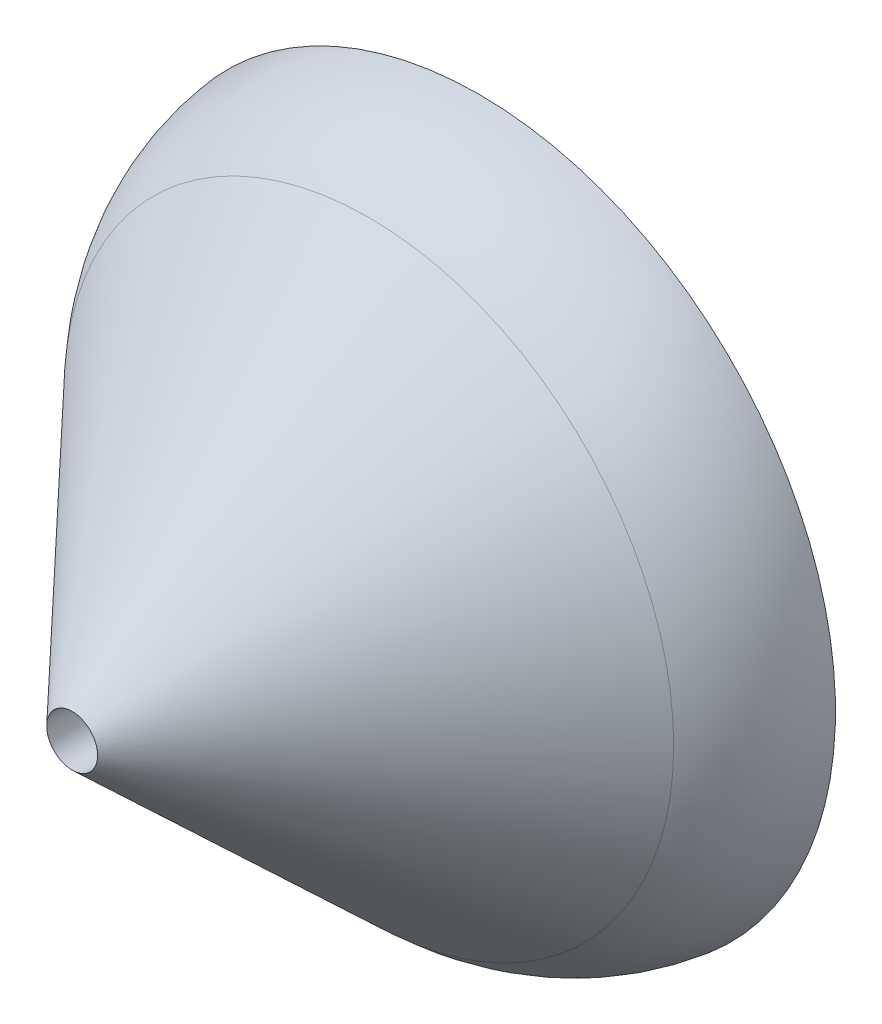
ISO-10303-21;
HEADER;
FILE_DESCRIPTION(('STEP AP214'),'2;1');
FILE_NAME('part.step','',(''),(''),'','','');
FILE_SCHEMA(('AUTOMOTIVE_DESIGN { 1 0 10303 214 1 1 1 1 }'));
ENDSEC;
DATA;
#1=APPLICATION_CONTEXT('core data for automotive mechanical design processes');
#2=APPLICATION_PROTOCOL_DEFINITION('international standard','automotive_design',2000,#1);
#3=PRODUCT_CONTEXT('',#1,'mechanical');
#4=PRODUCT('Part','Part','',(#3));
#5=PRODUCT_RELATED_PRODUCT_CATEGORY('part','',(#4));
#6=PRODUCT_DEFINITION_FORMATION('','',#4);
#7=PRODUCT_DEFINITION_CONTEXT('part definition',#1,'design');
#8=PRODUCT_DEFINITION('design','',#6,#7);
#9=PRODUCT_DEFINITION_SHAPE('','',#8);
#10=(LENGTH_UNIT() NAMED_UNIT(*) SI_UNIT(.MILLI.,.METRE.));
#11=(NAMED_UNIT(*) PLANE_ANGLE_UNIT() SI_UNIT($,.RADIAN.));
#12=(NAMED_UNIT(*) SI_UNIT($,.STERADIAN.) SOLID_ANGLE_UNIT());
#13=UNCERTAINTY_MEASURE_WITH_UNIT(LENGTH_MEASURE(1.E-05),#10,'distance_accuracy_value','');
#14=(GEOMETRIC_REPRESENTATION_CONTEXT(3) GLOBAL_UNCERTAINTY_ASSIGNED_CONTEXT((#13)) GLOBAL_UNIT_ASSIGNED_CONTEXT((#10,
#11,#12)) REPRESENTATION_CONTEXT('',''));
#15=CARTESIAN_POINT('',(0.,0.,0.));
#16=DIRECTION('',(0.,0.,1.));
#17=DIRECTION('',(1.,0.,0.));
#18=AXIS2_PLACEMENT_3D('',#15,#16,#17);
#19=CARTESIAN_POINT('',(0.,-88.9,0.));
#20=DIRECTION('',(0.,0.,1.));
#21=DIRECTION('',(0.,-1.,0.));
#22=AXIS2_PLACEMENT_3D('',#19,#20,#21);
#23=PLANE('',#22);
#24=CARTESIAN_POINT('',(0.,0.,0.));
#25=DIRECTION('',(0.,0.,-1.));
#26=DIRECTION('',(0.,1.,0.));
#27=AXIS2_PLACEMENT_3D('',#24,#25,#26);
#28=CIRCLE('',#27,50.8);
#29=CARTESIAN_POINT('',(0.,50.8,0.));
#30=VERTEX_POINT('',#29);
#31=EDGE_CURVE('E46',#30,#30,#28,.T.);
#32=ORIENTED_EDGE('',*,*,#31,.F.);
#33=EDGE_LOOP('',(#32));
#34=FACE_BOUND('',#33,.T.);
#35=CARTESIAN_POINT('',(0.,0.,0.));
#36=DIRECTION('',(0.,0.,-1.));
#37=DIRECTION('',(0.,1.,0.));
#38=AXIS2_PLACEMENT_3D('',#35,#36,#37);
#39=CIRCLE('',#38,88.9);
#40=CARTESIAN_POINT('',(0.,88.9,0.));
#41=VERTEX_POINT('',#40);
#42=EDGE_CURVE('E74',#41,#41,#39,.T.);
#43=ORIENTED_EDGE('',*,*,#42,.T.);
#44=EDGE_LOOP('',(#43));
#45=FACE_BOUND('',#44,.T.);
#46=ADVANCED_FACE('F39',(#34,#45),#23,.F.);
#47=CARTESIAN_POINT('',(0.,0.,0.));
#48=DIRECTION('',(0.,0.,-1.));
#49=DIRECTION('',(0.,1.,0.));
#50=AXIS2_PLACEMENT_3D('',#47,#48,#49);
#51=CYLINDRICAL_SURFACE('',#50,50.8000000000001);
#52=CARTESIAN_POINT('',(0.,0.,13.9604880961796));
#53=DIRECTION('',(0.,0.,-1.));
#54=DIRECTION('',(0.,1.,0.));
#55=AXIS2_PLACEMENT_3D('',#52,#53,#54);
#56=CIRCLE('',#55,50.8000000000001);
#57=CARTESIAN_POINT('',(0.,50.8000000000001,13.9604880961797));
#58=VERTEX_POINT('',#57);
#59=EDGE_CURVE('E50',#58,#58,#56,.T.);
#60=ORIENTED_EDGE('',*,*,#59,.F.);
#61=EDGE_LOOP('',(#60));
#62=FACE_BOUND('',#61,.T.);
#63=ORIENTED_EDGE('',*,*,#31,.T.);
#64=EDGE_LOOP('',(#63));
#65=FACE_BOUND('',#64,.T.);
#66=ADVANCED_FACE('F88',(#62,#65),#51,.F.);
#67=CARTESIAN_POINT('',(0.,0.,13.9604880961796));
#68=DIRECTION('',(0.,0.,-1.));
#69=DIRECTION('',(0.,1.,0.));
#70=AXIS2_PLACEMENT_3D('',#67,#68,#69);
#71=CONICAL_SURFACE('',#70,50.8000000000001,0.755502105379967);
#72=CARTESIAN_POINT('',(0.,0.,22.596357665238));
#73=DIRECTION('',(0.,0.,-1.));
#74=DIRECTION('',(0.,1.,0.));
#75=AXIS2_PLACEMENT_3D('',#72,#73,#74);
#76=CIRCLE('',#75,42.6656435044034);
#77=CARTESIAN_POINT('',(0.,42.6656435044034,22.596357665238));
#78=VERTEX_POINT('',#77);
#79=EDGE_CURVE('E54',#78,#78,#76,.T.);
#80=ORIENTED_EDGE('',*,*,#79,.F.);
#81=EDGE_LOOP('',(#80));
#82=FACE_BOUND('',#81,.T.);
#83=ORIENTED_EDGE('',*,*,#59,.T.);
#84=EDGE_LOOP('',(#83));
#85=FACE_BOUND('',#84,.T.);
#86=ADVANCED_FACE('F93',(#82,#85),#71,.F.);
#87=CARTESIAN_POINT('',(0.,-42.6656435044034,22.596357665238));
#88=DIRECTION('',(0.,0.,1.));
#89=DIRECTION('',(0.,-1.,0.));
#90=AXIS2_PLACEMENT_3D('',#87,#88,#89);
#91=PLANE('',#90);
#92=CARTESIAN_POINT('',(0.,0.,22.596357665238));
#93=DIRECTION('',(0.,0.,-1.));
#94=DIRECTION('',(0.,1.,0.));
#95=AXIS2_PLACEMENT_3D('',#92,#93,#94);
#96=CIRCLE('',#95,6.35);
#97=CARTESIAN_POINT('',(0.,6.34999999999999,22.596357665238));
#98=VERTEX_POINT('',#97);
#99=EDGE_CURVE('E59',#98,#98,#96,.T.);
#100=ORIENTED_EDGE('',*,*,#99,.F.);
#101=EDGE_LOOP('',(#100));
#102=FACE_BOUND('',#101,.T.);
#103=ORIENTED_EDGE('',*,*,#79,.T.);
#104=EDGE_LOOP('',(#103));
#105=FACE_BOUND('',#104,.T.);
#106=ADVANCED_FACE('F99',(#102,#105),#91,.F.);
#107=CARTESIAN_POINT('',(0.,0.,0.));
#108=DIRECTION('',(0.,0.,-1.));
#109=DIRECTION('',(0.,1.,0.));
#110=AXIS2_PLACEMENT_3D('',#107,#108,#109);
#111=CYLINDRICAL_SURFACE('',#110,6.34999999999999);
#112=CARTESIAN_POINT('',(0.,0.,35.296357665238));
#113=DIRECTION('',(0.,0.,-1.));
#114=DIRECTION('',(0.,1.,0.));
#115=AXIS2_PLACEMENT_3D('',#112,#113,#114);
#116=CIRCLE('',#115,6.34999999999999);
#117=CARTESIAN_POINT('',(0.,6.34999999999999,35.296357665238));
#118=VERTEX_POINT('',#117);
#119=EDGE_CURVE('E62',#118,#118,#116,.T.);
#120=ORIENTED_EDGE('',*,*,#119,.F.);
#121=EDGE_LOOP('',(#120));
#122=FACE_BOUND('',#121,.T.);
#123=ORIENTED_EDGE('',*,*,#99,.T.);
#124=EDGE_LOOP('',(#123));
#125=FACE_BOUND('',#124,.T.);
#126=ADVANCED_FACE('F103',(#122,#125),#111,.F.);
#127=CARTESIAN_POINT('',(0.,-6.35,35.296357665238));
#128=DIRECTION('',(0.,0.,-1.));
#129=DIRECTION('',(0.,1.,0.));
#130=AXIS2_PLACEMENT_3D('',#127,#128,#129);
#131=PLANE('',#130);
#132=CARTESIAN_POINT('',(0.,0.,35.296357665238));
#133=DIRECTION('',(0.,0.,-1.));
#134=DIRECTION('',(0.,1.,0.));
#135=AXIS2_PLACEMENT_3D('',#132,#133,#134);
#136=CIRCLE('',#135,30.7031738691258);
#137=CARTESIAN_POINT('',(0.,30.7031738691258,35.296357665238));
#138=VERTEX_POINT('',#137);
#139=EDGE_CURVE('E65',#138,#138,#136,.T.);
#140=ORIENTED_EDGE('',*,*,#139,.F.);
#141=EDGE_LOOP('',(#140));
#142=FACE_BOUND('',#141,.T.);
#143=ORIENTED_EDGE('',*,*,#119,.T.);
#144=EDGE_LOOP('',(#143));
#145=FACE_BOUND('',#144,.T.);
#146=ADVANCED_FACE('F107',(#142,#145),#131,.F.);
#147=CARTESIAN_POINT('',(0.,0.,35.296357665238));
#148=DIRECTION('',(0.,0.,-1.));
#149=DIRECTION('',(0.,1.,0.));
#150=AXIS2_PLACEMENT_3D('',#147,#148,#149);
#151=CONICAL_SURFACE('',#150,30.7031738691258,0.755502105379966);
#152=CARTESIAN_POINT('',(0.,0.,61.150994505929));
#153=DIRECTION('',(0.,0.,-1.));
#154=DIRECTION('',(0.,1.,0.));
#155=AXIS2_PLACEMENT_3D('',#152,#153,#154);
#156=CIRCLE('',#155,6.35000000000018);
#157=CARTESIAN_POINT('',(0.,6.35000000000017,61.150994505929));
#158=VERTEX_POINT('',#157);
#159=EDGE_CURVE('E68',#158,#158,#156,.T.);
#160=CARTESIAN_POINT('',(0.,6.35000000000017,61.150994505929));
#161=CARTESIAN_POINT('',(0.,6.60367889447023,60.8816753721718));
#162=CARTESIAN_POINT('',(0.,6.85735778894028,60.6123562384146));
#163=CARTESIAN_POINT('',(0.,7.3647155778804,60.0737179709002));
#164=CARTESIAN_POINT('',(0.,7.61839447235046,59.804398837143));
#165=CARTESIAN_POINT('',(0.,8.12575226129058,59.2657605696286));
#166=CARTESIAN_POINT('',(0.,8.37943115576064,58.9964414358714));
#167=CARTESIAN_POINT('',(0.,8.88678894470075,58.457803168357));
#168=CARTESIAN_POINT('',(0.,9.14046783917081,58.1884840345998));
#169=CARTESIAN_POINT('',(0.,9.64782562811093,57.6498457670854));
#170=CARTESIAN_POINT('',(0.,9.90150452258099,57.3805266333282));
#171=CARTESIAN_POINT('',(0.,10.4088623115211,56.8418883658139));
#172=CARTESIAN_POINT('',(0.,10.6625412059912,56.5725692320567));
#173=CARTESIAN_POINT('',(0.,11.1698989949313,56.0339309645423));
#174=CARTESIAN_POINT('',(0.,11.4235778894013,55.7646118307851));
#175=CARTESIAN_POINT('',(0.,11.9309356783415,55.2259735632707));
#176=CARTESIAN_POINT('',(0.,12.1846145728115,54.9566544295135));
#177=CARTESIAN_POINT('',(0.,12.6919723617516,54.4180161619991));
#178=CARTESIAN_POINT('',(0.,12.9456512562217,54.1486970282419));
#179=CARTESIAN_POINT('',(0.,13.4530090451618,53.6100587607275));
#180=CARTESIAN_POINT('',(0.,13.7066879396319,53.3407396269703));
#181=CARTESIAN_POINT('',(0.,14.214045728572,52.8021013594559));
#182=CARTESIAN_POINT('',(0.,14.4677246230421,52.5327822256987));
#183=CARTESIAN_POINT('',(0.,14.9750824119822,51.9941439581843));
#184=CARTESIAN_POINT('',(0.,15.2287613064522,51.7248248244271));
#185=CARTESIAN_POINT('',(0.,15.7361190953923,51.1861865569127));
#186=CARTESIAN_POINT('',(0.,15.9897979898624,50.9168674231555));
#187=CARTESIAN_POINT('',(0.,16.4971557788025,50.3782291556411));
#188=CARTESIAN_POINT('',(0.,16.7508346732726,50.1089100218839));
#189=CARTESIAN_POINT('',(0.,17.2581924622127,49.5702717543695));
#190=CARTESIAN_POINT('',(0.,17.5118713566828,49.3009526206123));
#191=CARTESIAN_POINT('',(0.,18.0192291456229,48.7623143530979));
#192=CARTESIAN_POINT('',(0.,18.2729080400929,48.4929952193407));
#193=CARTESIAN_POINT('',(0.,18.780265829033,47.9543569518263));
#194=CARTESIAN_POINT('',(0.,19.0339447235031,47.6850378180691));
#195=CARTESIAN_POINT('',(0.,19.5413025124432,47.1463995505547));
#196=CARTESIAN_POINT('',(0.,19.7949814069133,46.8770804167975));
#197=CARTESIAN_POINT('',(0.,20.3023391958534,46.3384421492831));
#198=CARTESIAN_POINT('',(0.,20.5560180903235,46.0691230155259));
#199=CARTESIAN_POINT('',(0.,21.0633758792636,45.5304847480115));
#200=CARTESIAN_POINT('',(0.,21.3170547737336,45.2611656142543));
#201=CARTESIAN_POINT('',(0.,21.8244125626738,44.7225273467399));
#202=CARTESIAN_POINT('',(0.,22.0780914571438,44.4532082129827));
#203=CARTESIAN_POINT('',(0.,22.5854492460839,43.9145699454684));
#204=CARTESIAN_POINT('',(0.,22.839128140554,43.6452508117111));
#205=CARTESIAN_POINT('',(0.,23.3464859294941,43.1066125441968));
#206=CARTESIAN_POINT('',(0.,23.6001648239642,42.8372934104396));
#207=CARTESIAN_POINT('',(0.,24.1075226129043,42.2986551429252));
#208=CARTESIAN_POINT('',(0.,24.3612015073743,42.029336009168));
#209=CARTESIAN_POINT('',(0.,24.8685592963145,41.4906977416536));
#210=CARTESIAN_POINT('',(0.,25.1222381907845,41.2213786078964));
#211=CARTESIAN_POINT('',(0.,25.6295959797246,40.682740340382));
#212=CARTESIAN_POINT('',(0.,25.8832748741947,40.4134212066248));
#213=CARTESIAN_POINT('',(0.,26.3906326631348,39.8747829391104));
#214=CARTESIAN_POINT('',(0.,26.6443115576049,39.6054638053532));
#215=CARTESIAN_POINT('',(0.,27.151669346545,39.0668255378388));
#216=CARTESIAN_POINT('',(0.,27.405348241015,38.7975064040816));
#217=CARTESIAN_POINT('',(0.,27.9127060299552,38.2588681365672));
#218=CARTESIAN_POINT('',(0.,28.1663849244252,37.98954900281));
#219=CARTESIAN_POINT('',(0.,28.6737427133653,37.4509107352956));
#220=CARTESIAN_POINT('',(0.,28.9274216078354,37.1815916015384));
#221=CARTESIAN_POINT('',(0.,29.4347793967755,36.642953334024));
#222=CARTESIAN_POINT('',(0.,29.6884582912456,36.3736342002668));
#223=CARTESIAN_POINT('',(0.,30.1958160801857,35.8349959327524));
#224=CARTESIAN_POINT('',(0.,30.4494949746557,35.5656767989952));
#225=CARTESIAN_POINT('',(0.,30.7031738691258,35.296357665238));
#226=B_SPLINE_CURVE_WITH_KNOTS('',3,(#160,#161,#162,#163,#164,#165,#166,#167,#168,#169,#170,
#171,#172,#173,#174,#175,#176,#177,#178,#179,#180,#181,#182,#183,#184,#185,#186,#187,#188,#189,
#190,#191,#192,#193,#194,#195,#196,#197,#198,#199,#200,#201,#202,#203,#204,#205,#206,#207,#208,
#209,#210,#211,#212,#213,#214,#215,#216,#217,#218,#219,#220,#221,#222,#223,#224,#225),
.UNSPECIFIED.,.F.,.F.,(4,2,2,2,2,2,2,2,2,2,2,2,2,2,2,2,2,2,2,2,2,2,2,2,2,2,2,2,2,2,2,2,4),(0.,
1.10994233893725,2.21988467787452,3.32982701681177,4.43976935574903,5.54971169468628,
6.65965403362354,7.7695963725608,8.87953871149805,9.98948105043531,11.0994233893726,
12.2093657283098,13.3193080672471,14.4292504061843,15.5391927451216,16.6491350840588,
17.7590774229961,18.8690197619334,19.9789621008706,21.0889044398079,22.1988467787451,
23.3087891176824,24.4187314566196,25.5286737955569,26.6386161344942,27.7485584734314,
28.8585008123687,29.9684431513059,31.0783854902432,32.1883278291804,33.2982701681177,
34.408212507055,35.5181548459922),.UNSPECIFIED.);
#227=EDGE_CURVE('BSEAM111',#158,#138,#226,.T.);
#228=ORIENTED_EDGE('',*,*,#159,.F.);
#229=ORIENTED_EDGE('',*,*,#139,.T.);
#230=ORIENTED_EDGE('',*,*,#227,.T.);
#231=ORIENTED_EDGE('',*,*,#227,.F.);
#232=EDGE_LOOP('',(#228,#230,#229,#231));
#233=FACE_BOUND('',#232,.T.);
#234=ADVANCED_FACE('F111',(#233),#151,.F.);
#235=CARTESIAN_POINT('',(0.,0.,0.));
#236=DIRECTION('',(0.,0.,-1.));
#237=DIRECTION('',(0.,1.,0.));
#238=AXIS2_PLACEMENT_3D('',#235,#236,#237);
#239=CYLINDRICAL_SURFACE('',#238,6.3500000000001);
#240=CARTESIAN_POINT('',(0.,0.,101.6));
#241=DIRECTION('',(0.,0.,-1.));
#242=DIRECTION('',(0.,1.,0.));
#243=AXIS2_PLACEMENT_3D('',#240,#241,#242);
#244=CIRCLE('',#243,6.35000000000003);
#245=CARTESIAN_POINT('',(0.,6.35,101.6));
#246=VERTEX_POINT('',#245);
#247=EDGE_CURVE('E71',#246,#246,#244,.T.);
#248=ORIENTED_EDGE('',*,*,#247,.F.);
#249=EDGE_LOOP('',(#248));
#250=FACE_BOUND('',#249,.T.);
#251=ORIENTED_EDGE('',*,*,#159,.T.);
#252=EDGE_LOOP('',(#251));
#253=FACE_BOUND('',#252,.T.);
#254=ADVANCED_FACE('F85',(#250,#253),#239,.F.);
#255=CARTESIAN_POINT('',(0.,0.,101.6));
#256=DIRECTION('',(0.,0.,-1.));
#257=DIRECTION('',(0.,1.,0.));
#258=AXIS2_PLACEMENT_3D('',#255,#256,#257);
#259=CONICAL_SURFACE('',#258,6.35000000000003,0.755502105379966);
#260=CARTESIAN_POINT('',(0.,0.,27.5631904095811));
#261=DIRECTION('',(0.,0.,1.));
#262=DIRECTION('',(0.,-1.,0.));
#263=AXIS2_PLACEMENT_3D('',#260,#261,#262);
#264=CIRCLE('',#263,76.0872509148202);
#265=CARTESIAN_POINT('',(0.,76.0872509148202,27.5631904095811));
#266=VERTEX_POINT('',#265);
#267=EDGE_CURVE('E10',#266,#266,#264,.T.);
#268=CARTESIAN_POINT('',(0.,76.0872509148202,27.5631904095811));
#269=CARTESIAN_POINT('',(0.,75.3608212177908,28.334407176148));
#270=CARTESIAN_POINT('',(0.,74.6343915207615,29.1056239427148));
#271=CARTESIAN_POINT('',(0.,73.1815321267027,30.6480574758486));
#272=CARTESIAN_POINT('',(0.,72.4551024296733,31.4192742424155));
#273=CARTESIAN_POINT('',(0.,71.0022430356146,32.9617077755492));
#274=CARTESIAN_POINT('',(0.,70.2758133385852,33.732924542116));
#275=CARTESIAN_POINT('',(0.,68.8229539445264,35.2753580752498));
#276=CARTESIAN_POINT('',(0.,68.0965242474971,36.0465748418166));
#277=CARTESIAN_POINT('',(0.,66.6436648534383,37.5890083749504));
#278=CARTESIAN_POINT('',(0.,65.9172351564089,38.3602251415172));
#279=CARTESIAN_POINT('',(0.,64.4643757623502,39.902658674651));
#280=CARTESIAN_POINT('',(0.,63.7379460653208,40.6738754412178));
#281=CARTESIAN_POINT('',(0.,62.2850866712621,42.2163089743515));
#282=CARTESIAN_POINT('',(0.,61.5586569742327,42.9875257409184));
#283=CARTESIAN_POINT('',(0.,60.1057975801739,44.5299592740521));
#284=CARTESIAN_POINT('',(0.,59.3793678831445,45.301176040619));
#285=CARTESIAN_POINT('',(0.,57.9265084890858,46.8436095737527));
#286=CARTESIAN_POINT('',(0.,57.2000787920564,47.6148263403196));
#287=CARTESIAN_POINT('',(0.,55.7472193979977,49.1572598734533));
#288=CARTESIAN_POINT('',(0.,55.0207897009683,49.9284766400202));
#289=CARTESIAN_POINT('',(0.,53.5679303069095,51.4709101731539));
#290=CARTESIAN_POINT('',(0.,52.8415006098801,52.2421269397208));
#291=CARTESIAN_POINT('',(0.,51.3886412158214,53.7845604728545));
#292=CARTESIAN_POINT('',(0.,50.662211518792,54.5557772394214));
#293=CARTESIAN_POINT('',(0.,49.2093521247333,56.0982107725551));
#294=CARTESIAN_POINT('',(0.,48.4829224277039,56.869427539122));
#295=CARTESIAN_POINT('',(0.,47.0300630336451,58.4118610722557));
#296=CARTESIAN_POINT('',(0.,46.3036333366158,59.1830778388226));
#297=CARTESIAN_POINT('',(0.,44.850773942557,60.7255113719563));
#298=CARTESIAN_POINT('',(0.,44.1243442455276,61.4967281385232));
#299=CARTESIAN_POINT('',(0.,42.6714848514689,63.0391616716569));
#300=CARTESIAN_POINT('',(0.,41.9450551544395,63.8103784382238));
#301=CARTESIAN_POINT('',(0.,40.4921957603807,65.3528119713575));
#302=CARTESIAN_POINT('',(0.,39.7657660633514,66.1240287379244));
#303=CARTESIAN_POINT('',(0.,38.3129066692926,67.6664622710581));
#304=CARTESIAN_POINT('',(0.,37.5864769722632,68.437679037625));
#305=CARTESIAN_POINT('',(0.,36.1336175782045,69.9801125707587));
#306=CARTESIAN_POINT('',(0.,35.4071878811751,70.7513293373255));
#307=CARTESIAN_POINT('',(0.,33.9543284871163,72.2937628704593));
#308=CARTESIAN_POINT('',(0.,33.227898790087,73.0649796370261));
#309=CARTESIAN_POINT('',(0.,31.7750393960282,74.6074131701599));
#310=CARTESIAN_POINT('',(0.,31.0486096989988,75.3786299367268));
#311=CARTESIAN_POINT('',(0.,29.5957503049401,76.9210634698605));
#312=CARTESIAN_POINT('',(0.,28.8693206079107,77.6922802364273));
#313=CARTESIAN_POINT('',(0.,27.4164612138519,79.234713769561));
#314=CARTESIAN_POINT('',(0.,26.6900315168226,80.0059305361279));
#315=CARTESIAN_POINT('',(0.,25.2371721227638,81.5483640692617));
#316=CARTESIAN_POINT('',(0.,24.5107424257344,82.3195808358285));
#317=CARTESIAN_POINT('',(0.,23.0578830316757,83.8620143689622));
#318=CARTESIAN_POINT('',(0.,22.3314533346463,84.6332311355291));
#319=CARTESIAN_POINT('',(0.,20.8785939405875,86.1756646686628));
#320=CARTESIAN_POINT('',(0.,20.1521642435582,86.9468814352297));
#321=CARTESIAN_POINT('',(0.,18.6993048494994,88.4893149683634));
#322=CARTESIAN_POINT('',(0.,17.97287515247,89.2605317349303));
#323=CARTESIAN_POINT('',(0.,16.5200157584113,90.802965268064));
#324=CARTESIAN_POINT('',(0.,15.7935860613819,91.5741820346309));
#325=CARTESIAN_POINT('',(0.,14.3407266673232,93.1166155677646));
#326=CARTESIAN_POINT('',(0.,13.6142969702938,93.8878323343315));
#327=CARTESIAN_POINT('',(0.,12.161437576235,95.4302658674652));
#328=CARTESIAN_POINT('',(0.,11.4350078792056,96.2014826340321));
#329=CARTESIAN_POINT('',(0.,9.9821484851469,97.7439161671658));
#330=CARTESIAN_POINT('',(0.,9.25571878811752,98.5151329337327));
#331=CARTESIAN_POINT('',(0.,7.80285939405876,100.057566466866));
#332=CARTESIAN_POINT('',(0.,7.07642969702938,100.828783233433));
#333=CARTESIAN_POINT('',(0.,6.35,101.6));
#334=B_SPLINE_CURVE_WITH_KNOTS('',3,(#268,#269,#270,#271,#272,#273,#274,#275,#276,#277,#278,
#279,#280,#281,#282,#283,#284,#285,#286,#287,#288,#289,#290,#291,#292,#293,#294,#295,#296,#297,
#298,#299,#300,#301,#302,#303,#304,#305,#306,#307,#308,#309,#310,#311,#312,#313,#314,#315,#316,
#317,#318,#319,#320,#321,#322,#323,#324,#325,#326,#327,#328,#329,#330,#331,#332,#333),
.UNSPECIFIED.,.F.,.F.,(4,2,2,2,2,2,2,2,2,2,2,2,2,2,2,2,2,2,2,2,2,2,2,2,2,2,2,2,2,2,2,2,4),(0.,
3.17840819465349,6.35681638930697,9.53522458396044,12.7136327786139,15.8920409732674,
19.0704491679209,22.2488573625743,25.4272655572278,28.6056737518813,31.7840819465348,
34.9624901411883,38.1408983358417,41.3193065304952,44.4977147251487,47.6761229198022,
50.8545311144557,54.0329393091092,57.2113475037626,60.3897556984161,63.5681638930696,
66.7465720877231,69.9249802823765,73.10338847703,76.2817966716835,79.460204866337,
82.6386130609904,85.8170212556439,88.9954294502974,92.1738376449509,95.3522458396043,
98.5306540342578,101.709062228911),.UNSPECIFIED.);
#335=EDGE_CURVE('BSEAM80',#266,#246,#334,.T.);
#336=ORIENTED_EDGE('',*,*,#267,.T.);
#337=ORIENTED_EDGE('',*,*,#247,.T.);
#338=ORIENTED_EDGE('',*,*,#335,.T.);
#339=ORIENTED_EDGE('',*,*,#335,.F.);
#340=EDGE_LOOP('',(#336,#338,#337,#339));
#341=FACE_BOUND('',#340,.T.);
#342=ADVANCED_FACE('F80',(#341),#259,.T.);
#343=CARTESIAN_POINT('',(0.,0.,-5.52648375902565));
#344=DIRECTION('',(0.,0.,-1.));
#345=DIRECTION('',(0.,1.,0.));
#346=AXIS2_PLACEMENT_3D('',#343,#344,#345);
#347=DEGENERATE_TOROIDAL_SURFACE('',#346,40.9574763152667,48.26,.T.);
#348=ORIENTED_EDGE('',*,*,#267,.F.);
#349=EDGE_LOOP('',(#348));
#350=FACE_BOUND('',#349,.T.);
#351=ORIENTED_EDGE('',*,*,#42,.F.);
#352=EDGE_LOOP('',(#351));
#353=FACE_BOUND('',#352,.T.);
#354=ADVANCED_FACE('F41',(#350,#353),#347,.T.);
#355=CLOSED_SHELL('',(#46,#66,#86,#106,#126,#146,#234,#254,#342,#354));
#356=MANIFOLD_SOLID_BREP('B2',#355);
#357=ADVANCED_BREP_SHAPE_REPRESENTATION('',(#18,#356),#14);
#358=SHAPE_DEFINITION_REPRESENTATION(#9,#357);
ENDSEC;
END-ISO-10303-21;
